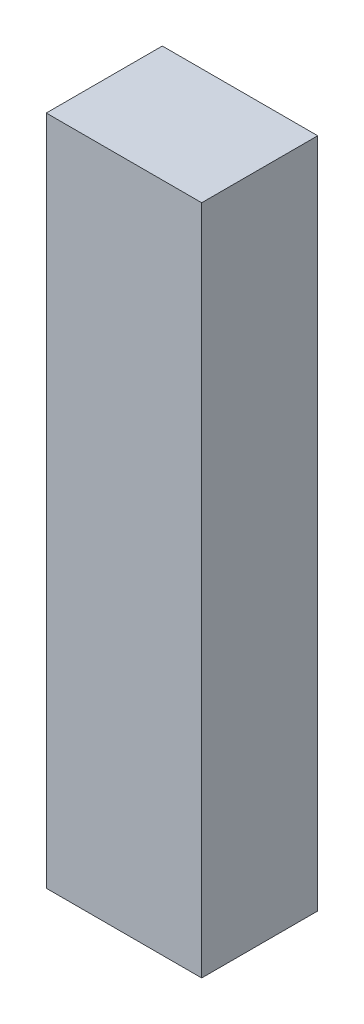
ISO-10303-21;
HEADER;
FILE_DESCRIPTION(('STEP AP214'),'2;1');
FILE_NAME('part.step','',(''),(''),'','','');
FILE_SCHEMA(('AUTOMOTIVE_DESIGN { 1 0 10303 214 1 1 1 1 }'));
ENDSEC;
DATA;
#1=APPLICATION_CONTEXT('core data for automotive mechanical design processes');
#2=APPLICATION_PROTOCOL_DEFINITION('international standard','automotive_design',2000,#1);
#3=PRODUCT_CONTEXT('',#1,'mechanical');
#4=PRODUCT('Part','Part','',(#3));
#5=PRODUCT_RELATED_PRODUCT_CATEGORY('part','',(#4));
#6=PRODUCT_DEFINITION_FORMATION('','',#4);
#7=PRODUCT_DEFINITION_CONTEXT('part definition',#1,'design');
#8=PRODUCT_DEFINITION('design','',#6,#7);
#9=PRODUCT_DEFINITION_SHAPE('','',#8);
#10=(LENGTH_UNIT() NAMED_UNIT(*) SI_UNIT(.MILLI.,.METRE.));
#11=(NAMED_UNIT(*) PLANE_ANGLE_UNIT() SI_UNIT($,.RADIAN.));
#12=(NAMED_UNIT(*) SI_UNIT($,.STERADIAN.) SOLID_ANGLE_UNIT());
#13=UNCERTAINTY_MEASURE_WITH_UNIT(LENGTH_MEASURE(1.E-05),#10,'distance_accuracy_value','');
#14=(GEOMETRIC_REPRESENTATION_CONTEXT(3) GLOBAL_UNCERTAINTY_ASSIGNED_CONTEXT((#13)) GLOBAL_UNIT_ASSIGNED_CONTEXT((#10,
#11,#12)) REPRESENTATION_CONTEXT('',''));
#15=CARTESIAN_POINT('',(0.,0.,0.));
#16=DIRECTION('',(0.,0.,1.));
#17=DIRECTION('',(1.,0.,0.));
#18=AXIS2_PLACEMENT_3D('',#15,#16,#17);
#19=CARTESIAN_POINT('',(-27.8320890870254,254.,24.5000784216773));
#20=DIRECTION('',(1.,0.,0.));
#21=DIRECTION('',(0.,0.,-1.));
#22=AXIS2_PLACEMENT_3D('',#19,#20,#21);
#23=PLANE('',#22);
#24=DIRECTION('',(0.,0.,1.));
#25=VECTOR('',#24,1.);
#26=CARTESIAN_POINT('',(-27.8320890870254,0.,24.5000784216773));
#27=LINE('',#26,#25);
#28=CARTESIAN_POINT('',(-27.8320890870254,0.,-19.4040621099685));
#29=VERTEX_POINT('',#28);
#30=CARTESIAN_POINT('',(-27.8320890870254,0.,24.5000784216773));
#31=VERTEX_POINT('',#30);
#32=EDGE_CURVE('E96',#29,#31,#27,.T.);
#33=ORIENTED_EDGE('',*,*,#32,.T.);
#34=DIRECTION('',(0.,-1.,0.));
#35=VECTOR('',#34,1.);
#36=CARTESIAN_POINT('',(-27.8320890870254,254.,24.5000784216773));
#37=LINE('',#36,#35);
#38=CARTESIAN_POINT('',(-27.8320890870254,254.,24.5000784216773));
#39=VERTEX_POINT('',#38);
#40=EDGE_CURVE('E11',#39,#31,#37,.T.);
#41=ORIENTED_EDGE('',*,*,#40,.F.);
#42=DIRECTION('',(0.,0.,1.));
#43=VECTOR('',#42,1.);
#44=CARTESIAN_POINT('',(-27.8320890870254,254.,24.5000784216773));
#45=LINE('',#44,#43);
#46=CARTESIAN_POINT('',(-27.8320890870254,254.,-19.4040621099685));
#47=VERTEX_POINT('',#46);
#48=EDGE_CURVE('E84',#47,#39,#45,.T.);
#49=ORIENTED_EDGE('',*,*,#48,.F.);
#50=DIRECTION('',(0.,-1.,0.));
#51=VECTOR('',#50,1.);
#52=CARTESIAN_POINT('',(-27.8320890870254,254.,-19.4040621099685));
#53=LINE('',#52,#51);
#54=EDGE_CURVE('E92',#47,#29,#53,.T.);
#55=ORIENTED_EDGE('',*,*,#54,.T.);
#56=EDGE_LOOP('',(#33,#41,#49,#55));
#57=FACE_BOUND('',#56,.T.);
#58=ADVANCED_FACE('F33',(#57),#23,.F.);
#59=CARTESIAN_POINT('',(30.9680991250002,254.,24.5000784216773));
#60=DIRECTION('',(0.,0.,-1.));
#61=DIRECTION('',(-1.,0.,0.));
#62=AXIS2_PLACEMENT_3D('',#59,#60,#61);
#63=PLANE('',#62);
#64=DIRECTION('',(1.,0.,0.));
#65=VECTOR('',#64,1.);
#66=CARTESIAN_POINT('',(30.9680991250002,0.,24.5000784216773));
#67=LINE('',#66,#65);
#68=CARTESIAN_POINT('',(30.9680991250002,0.,24.5000784216773));
#69=VERTEX_POINT('',#68);
#70=EDGE_CURVE('E88',#31,#69,#67,.T.);
#71=ORIENTED_EDGE('',*,*,#70,.T.);
#72=DIRECTION('',(0.,-1.,0.));
#73=VECTOR('',#72,1.);
#74=CARTESIAN_POINT('',(30.9680991250002,254.,24.5000784216773));
#75=LINE('',#74,#73);
#76=CARTESIAN_POINT('',(30.9680991250002,254.,24.5000784216773));
#77=VERTEX_POINT('',#76);
#78=EDGE_CURVE('E41',#77,#69,#75,.T.);
#79=ORIENTED_EDGE('',*,*,#78,.F.);
#80=DIRECTION('',(1.,0.,0.));
#81=VECTOR('',#80,1.);
#82=CARTESIAN_POINT('',(30.9680991250002,254.,24.5000784216773));
#83=LINE('',#82,#81);
#84=EDGE_CURVE('E79',#39,#77,#83,.T.);
#85=ORIENTED_EDGE('',*,*,#84,.F.);
#86=ORIENTED_EDGE('',*,*,#40,.T.);
#87=EDGE_LOOP('',(#71,#79,#85,#86));
#88=FACE_BOUND('',#87,.T.);
#89=ADVANCED_FACE('F87',(#88),#63,.F.);
#90=CARTESIAN_POINT('',(30.9680991250002,254.,-19.4040621099685));
#91=DIRECTION('',(-1.,0.,0.));
#92=DIRECTION('',(0.,0.,1.));
#93=AXIS2_PLACEMENT_3D('',#90,#91,#92);
#94=PLANE('',#93);
#95=DIRECTION('',(0.,0.,-1.));
#96=VECTOR('',#95,1.);
#97=CARTESIAN_POINT('',(30.9680991250002,0.,-19.4040621099685));
#98=LINE('',#97,#96);
#99=CARTESIAN_POINT('',(30.9680991250002,0.,-19.4040621099685));
#100=VERTEX_POINT('',#99);
#101=EDGE_CURVE('E66',#69,#100,#98,.T.);
#102=ORIENTED_EDGE('',*,*,#101,.T.);
#103=DIRECTION('',(0.,-1.,0.));
#104=VECTOR('',#103,1.);
#105=CARTESIAN_POINT('',(30.9680991250002,254.,-19.4040621099685));
#106=LINE('',#105,#104);
#107=CARTESIAN_POINT('',(30.9680991250002,254.,-19.4040621099685));
#108=VERTEX_POINT('',#107);
#109=EDGE_CURVE('E89',#108,#100,#106,.T.);
#110=ORIENTED_EDGE('',*,*,#109,.F.);
#111=DIRECTION('',(0.,0.,-1.));
#112=VECTOR('',#111,1.);
#113=CARTESIAN_POINT('',(30.9680991250002,254.,-19.4040621099685));
#114=LINE('',#113,#112);
#115=EDGE_CURVE('E82',#77,#108,#114,.T.);
#116=ORIENTED_EDGE('',*,*,#115,.F.);
#117=ORIENTED_EDGE('',*,*,#78,.T.);
#118=EDGE_LOOP('',(#102,#110,#116,#117));
#119=FACE_BOUND('',#118,.T.);
#120=ADVANCED_FACE('F90',(#119),#94,.F.);
#121=CARTESIAN_POINT('',(-27.8320890870254,254.,-19.4040621099685));
#122=DIRECTION('',(0.,0.,1.));
#123=DIRECTION('',(1.,0.,0.));
#124=AXIS2_PLACEMENT_3D('',#121,#122,#123);
#125=PLANE('',#124);
#126=DIRECTION('',(-1.,0.,0.));
#127=VECTOR('',#126,1.);
#128=CARTESIAN_POINT('',(-27.8320890870254,0.,-19.4040621099685));
#129=LINE('',#128,#127);
#130=EDGE_CURVE('E72',#100,#29,#129,.T.);
#131=ORIENTED_EDGE('',*,*,#130,.T.);
#132=ORIENTED_EDGE('',*,*,#54,.F.);
#133=DIRECTION('',(-1.,0.,0.));
#134=VECTOR('',#133,1.);
#135=CARTESIAN_POINT('',(-27.8320890870254,254.,-19.4040621099685));
#136=LINE('',#135,#134);
#137=EDGE_CURVE('E49',#108,#47,#136,.T.);
#138=ORIENTED_EDGE('',*,*,#137,.F.);
#139=ORIENTED_EDGE('',*,*,#109,.T.);
#140=EDGE_LOOP('',(#131,#132,#138,#139));
#141=FACE_BOUND('',#140,.T.);
#142=ADVANCED_FACE('F103',(#141),#125,.F.);
#143=CARTESIAN_POINT('',(0.,254.,0.));
#144=DIRECTION('',(0.,-1.,0.));
#145=DIRECTION('',(0.,0.,-1.));
#146=AXIS2_PLACEMENT_3D('',#143,#144,#145);
#147=PLANE('',#146);
#148=ORIENTED_EDGE('',*,*,#48,.T.);
#149=ORIENTED_EDGE('',*,*,#84,.T.);
#150=ORIENTED_EDGE('',*,*,#115,.T.);
#151=ORIENTED_EDGE('',*,*,#137,.T.);
#152=EDGE_LOOP('',(#148,#149,#150,#151));
#153=FACE_BOUND('',#152,.T.);
#154=ADVANCED_FACE('F80',(#153),#147,.F.);
#155=CARTESIAN_POINT('',(0.,0.,0.));
#156=DIRECTION('',(0.,-1.,0.));
#157=DIRECTION('',(0.,0.,-1.));
#158=AXIS2_PLACEMENT_3D('',#155,#156,#157);
#159=PLANE('',#158);
#160=ORIENTED_EDGE('',*,*,#32,.F.);
#161=ORIENTED_EDGE('',*,*,#130,.F.);
#162=ORIENTED_EDGE('',*,*,#101,.F.);
#163=ORIENTED_EDGE('',*,*,#70,.F.);
#164=EDGE_LOOP('',(#160,#161,#162,#163));
#165=FACE_BOUND('',#164,.T.);
#166=ADVANCED_FACE('F106',(#165),#159,.T.);
#167=CLOSED_SHELL('',(#58,#89,#120,#142,#154,#166));
#168=MANIFOLD_SOLID_BREP('B2',#167);
#169=ADVANCED_BREP_SHAPE_REPRESENTATION('',(#18,#168),#14);
#170=SHAPE_DEFINITION_REPRESENTATION(#9,#169);
ENDSEC;
END-ISO-10303-21;
